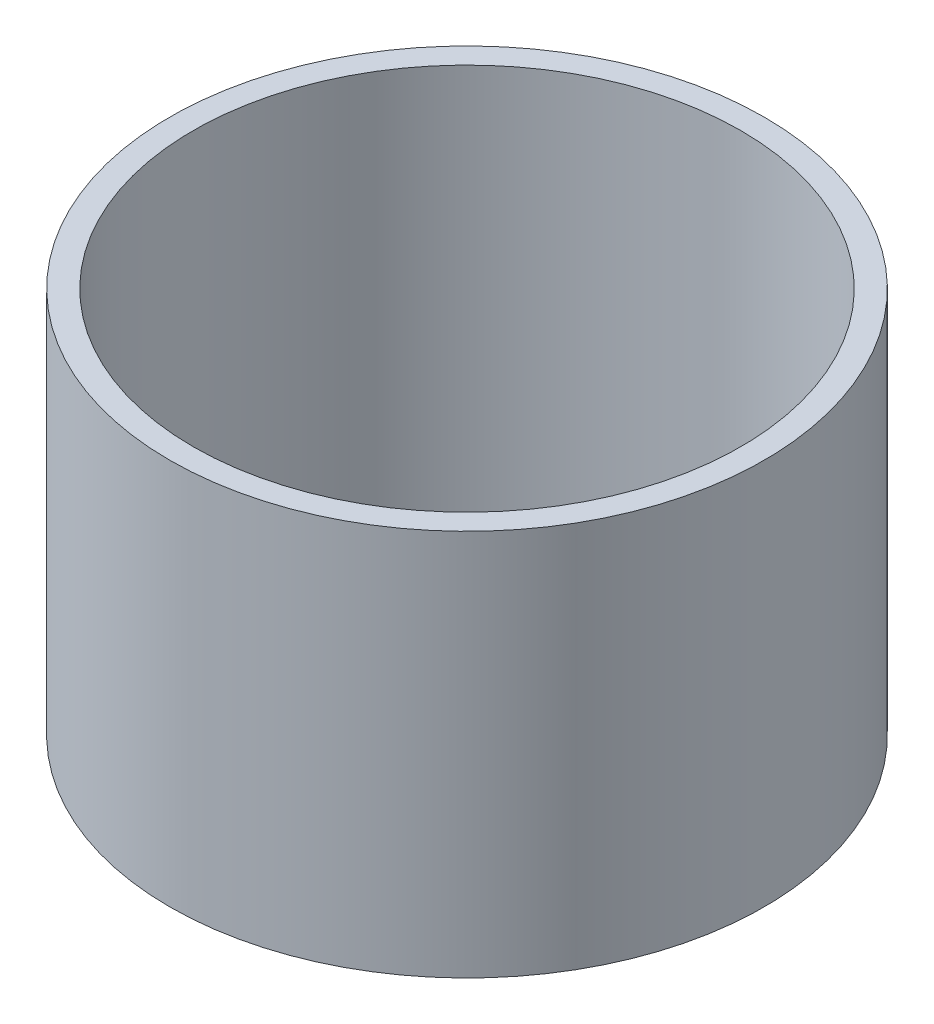
ISO-10303-21;
HEADER;
FILE_DESCRIPTION(('STEP AP214'),'2;1');
FILE_NAME('part.step','',(''),(''),'','','');
FILE_SCHEMA(('AUTOMOTIVE_DESIGN { 1 0 10303 214 1 1 1 1 }'));
ENDSEC;
DATA;
#1=APPLICATION_CONTEXT('core data for automotive mechanical design processes');
#2=APPLICATION_PROTOCOL_DEFINITION('international standard','automotive_design',2000,#1);
#3=PRODUCT_CONTEXT('',#1,'mechanical');
#4=PRODUCT('Part','Part','',(#3));
#5=PRODUCT_RELATED_PRODUCT_CATEGORY('part','',(#4));
#6=PRODUCT_DEFINITION_FORMATION('','',#4);
#7=PRODUCT_DEFINITION_CONTEXT('part definition',#1,'design');
#8=PRODUCT_DEFINITION('design','',#6,#7);
#9=PRODUCT_DEFINITION_SHAPE('','',#8);
#10=(LENGTH_UNIT() NAMED_UNIT(*) SI_UNIT(.MILLI.,.METRE.));
#11=(NAMED_UNIT(*) PLANE_ANGLE_UNIT() SI_UNIT($,.RADIAN.));
#12=(NAMED_UNIT(*) SI_UNIT($,.STERADIAN.) SOLID_ANGLE_UNIT());
#13=UNCERTAINTY_MEASURE_WITH_UNIT(LENGTH_MEASURE(1.E-05),#10,'distance_accuracy_value','');
#14=(GEOMETRIC_REPRESENTATION_CONTEXT(3) GLOBAL_UNCERTAINTY_ASSIGNED_CONTEXT((#13)) GLOBAL_UNIT_ASSIGNED_CONTEXT((#10,
#11,#12)) REPRESENTATION_CONTEXT('',''));
#15=CARTESIAN_POINT('',(0.,0.,0.));
#16=DIRECTION('',(0.,0.,1.));
#17=DIRECTION('',(1.,0.,0.));
#18=AXIS2_PLACEMENT_3D('',#15,#16,#17);
#19=CARTESIAN_POINT('',(0.,0.,0.));
#20=DIRECTION('',(0.,1.,0.));
#21=DIRECTION('',(0.,0.,1.));
#22=AXIS2_PLACEMENT_3D('',#19,#20,#21);
#23=CYLINDRICAL_SURFACE('',#22,7.747);
#24=CARTESIAN_POINT('',(0.,0.,0.));
#25=DIRECTION('',(0.,1.,0.));
#26=DIRECTION('',(0.,0.,1.));
#27=AXIS2_PLACEMENT_3D('',#24,#25,#26);
#28=CIRCLE('',#27,7.747);
#29=CARTESIAN_POINT('',(0.,0.,7.747));
#30=VERTEX_POINT('',#29);
#31=EDGE_CURVE('E10',#30,#30,#28,.T.);
#32=ORIENTED_EDGE('',*,*,#31,.T.);
#33=EDGE_LOOP('',(#32));
#34=FACE_BOUND('',#33,.T.);
#35=CARTESIAN_POINT('',(0.,10.0838,0.));
#36=DIRECTION('',(0.,1.,0.));
#37=DIRECTION('',(0.,0.,1.));
#38=AXIS2_PLACEMENT_3D('',#35,#36,#37);
#39=CIRCLE('',#38,7.747);
#40=CARTESIAN_POINT('',(0.,10.0838,7.747));
#41=VERTEX_POINT('',#40);
#42=EDGE_CURVE('E46',#41,#41,#39,.T.);
#43=ORIENTED_EDGE('',*,*,#42,.F.);
#44=EDGE_LOOP('',(#43));
#45=FACE_BOUND('',#44,.T.);
#46=ADVANCED_FACE('F32',(#34,#45),#23,.T.);
#47=CARTESIAN_POINT('',(7.747,0.,0.));
#48=DIRECTION('',(0.,-1.,0.));
#49=DIRECTION('',(0.,0.,-1.));
#50=AXIS2_PLACEMENT_3D('',#47,#48,#49);
#51=PLANE('',#50);
#52=CARTESIAN_POINT('',(0.,0.,0.));
#53=DIRECTION('',(0.,1.,0.));
#54=DIRECTION('',(0.,0.,1.));
#55=AXIS2_PLACEMENT_3D('',#52,#53,#54);
#56=CIRCLE('',#55,7.1374);
#57=CARTESIAN_POINT('',(0.,0.,7.1374));
#58=VERTEX_POINT('',#57);
#59=EDGE_CURVE('E38',#58,#58,#56,.T.);
#60=ORIENTED_EDGE('',*,*,#59,.T.);
#61=EDGE_LOOP('',(#60));
#62=FACE_BOUND('',#61,.T.);
#63=ORIENTED_EDGE('',*,*,#31,.F.);
#64=EDGE_LOOP('',(#63));
#65=FACE_BOUND('',#64,.T.);
#66=ADVANCED_FACE('F56',(#62,#65),#51,.T.);
#67=CARTESIAN_POINT('',(0.,0.,0.));
#68=DIRECTION('',(0.,1.,0.));
#69=DIRECTION('',(0.,0.,1.));
#70=AXIS2_PLACEMENT_3D('',#67,#68,#69);
#71=CYLINDRICAL_SURFACE('',#70,7.1374);
#72=CARTESIAN_POINT('',(0.,10.0838,0.));
#73=DIRECTION('',(0.,1.,0.));
#74=DIRECTION('',(0.,0.,1.));
#75=AXIS2_PLACEMENT_3D('',#72,#73,#74);
#76=CIRCLE('',#75,7.1374);
#77=CARTESIAN_POINT('',(0.,10.0838,7.1374));
#78=VERTEX_POINT('',#77);
#79=EDGE_CURVE('E42',#78,#78,#76,.T.);
#80=ORIENTED_EDGE('',*,*,#79,.T.);
#81=EDGE_LOOP('',(#80));
#82=FACE_BOUND('',#81,.T.);
#83=ORIENTED_EDGE('',*,*,#59,.F.);
#84=EDGE_LOOP('',(#83));
#85=FACE_BOUND('',#84,.T.);
#86=ADVANCED_FACE('F60',(#82,#85),#71,.F.);
#87=CARTESIAN_POINT('',(7.1374,10.0838,0.));
#88=DIRECTION('',(0.,1.,0.));
#89=DIRECTION('',(0.,0.,1.));
#90=AXIS2_PLACEMENT_3D('',#87,#88,#89);
#91=PLANE('',#90);
#92=ORIENTED_EDGE('',*,*,#42,.T.);
#93=EDGE_LOOP('',(#92));
#94=FACE_BOUND('',#93,.T.);
#95=ORIENTED_EDGE('',*,*,#79,.F.);
#96=EDGE_LOOP('',(#95));
#97=FACE_BOUND('',#96,.T.);
#98=ADVANCED_FACE('F52',(#94,#97),#91,.T.);
#99=CLOSED_SHELL('',(#46,#66,#86,#98));
#100=MANIFOLD_SOLID_BREP('B2',#99);
#101=ADVANCED_BREP_SHAPE_REPRESENTATION('',(#18,#100),#14);
#102=SHAPE_DEFINITION_REPRESENTATION(#9,#101);
ENDSEC;
END-ISO-10303-21;
